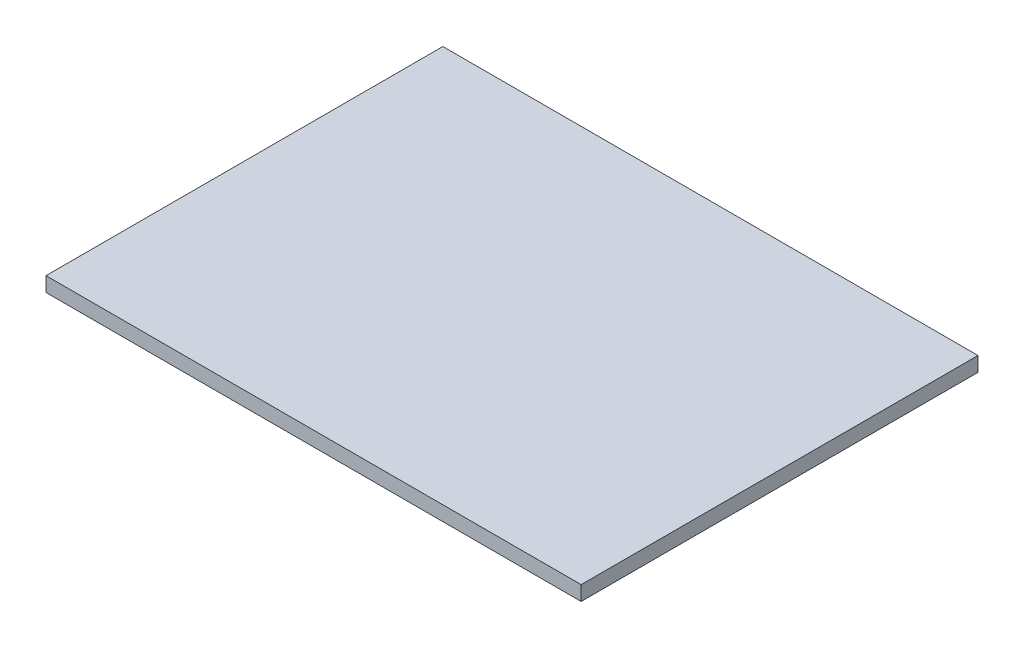
ISO-10303-21;
HEADER;
FILE_DESCRIPTION(('STEP AP214'),'2;1');
FILE_NAME('part.step','',(''),(''),'','','');
FILE_SCHEMA(('AUTOMOTIVE_DESIGN { 1 0 10303 214 1 1 1 1 }'));
ENDSEC;
DATA;
#1=APPLICATION_CONTEXT('core data for automotive mechanical design processes');
#2=APPLICATION_PROTOCOL_DEFINITION('international standard','automotive_design',2000,#1);
#3=PRODUCT_CONTEXT('',#1,'mechanical');
#4=PRODUCT('Part','Part','',(#3));
#5=PRODUCT_RELATED_PRODUCT_CATEGORY('part','',(#4));
#6=PRODUCT_DEFINITION_FORMATION('','',#4);
#7=PRODUCT_DEFINITION_CONTEXT('part definition',#1,'design');
#8=PRODUCT_DEFINITION('design','',#6,#7);
#9=PRODUCT_DEFINITION_SHAPE('','',#8);
#10=(LENGTH_UNIT() NAMED_UNIT(*) SI_UNIT(.MILLI.,.METRE.));
#11=(NAMED_UNIT(*) PLANE_ANGLE_UNIT() SI_UNIT($,.RADIAN.));
#12=(NAMED_UNIT(*) SI_UNIT($,.STERADIAN.) SOLID_ANGLE_UNIT());
#13=UNCERTAINTY_MEASURE_WITH_UNIT(LENGTH_MEASURE(1.E-05),#10,'distance_accuracy_value','');
#14=(GEOMETRIC_REPRESENTATION_CONTEXT(3) GLOBAL_UNCERTAINTY_ASSIGNED_CONTEXT((#13)) GLOBAL_UNIT_ASSIGNED_CONTEXT((#10,
#11,#12)) REPRESENTATION_CONTEXT('',''));
#15=CARTESIAN_POINT('',(0.,0.,0.));
#16=DIRECTION('',(0.,0.,1.));
#17=DIRECTION('',(1.,0.,0.));
#18=AXIS2_PLACEMENT_3D('',#15,#16,#17);
#19=CARTESIAN_POINT('',(476.,-13.,-353.));
#20=DIRECTION('',(-1.,0.,0.));
#21=DIRECTION('',(0.,0.,-1.));
#22=AXIS2_PLACEMENT_3D('',#19,#20,#21);
#23=PLANE('',#22);
#24=DIRECTION('',(0.,1.,0.));
#25=VECTOR('',#24,1.);
#26=CARTESIAN_POINT('',(476.,-13.,353.));
#27=LINE('',#26,#25);
#28=CARTESIAN_POINT('',(476.,-13.,353.));
#29=VERTEX_POINT('',#28);
#30=CARTESIAN_POINT('',(476.,13.,353.));
#31=VERTEX_POINT('',#30);
#32=EDGE_CURVE('E79',#29,#31,#27,.T.);
#33=ORIENTED_EDGE('',*,*,#32,.F.);
#34=DIRECTION('',(0.,0.,1.));
#35=VECTOR('',#34,1.);
#36=CARTESIAN_POINT('',(476.,-13.,-353.));
#37=LINE('',#36,#35);
#38=CARTESIAN_POINT('',(476.,-13.,-353.));
#39=VERTEX_POINT('',#38);
#40=EDGE_CURVE('E78',#39,#29,#37,.T.);
#41=ORIENTED_EDGE('',*,*,#40,.F.);
#42=DIRECTION('',(0.,1.,0.));
#43=VECTOR('',#42,1.);
#44=CARTESIAN_POINT('',(476.,-13.,-353.));
#45=LINE('',#44,#43);
#46=CARTESIAN_POINT('',(476.,13.,-353.));
#47=VERTEX_POINT('',#46);
#48=EDGE_CURVE('E73',#39,#47,#45,.T.);
#49=ORIENTED_EDGE('',*,*,#48,.T.);
#50=DIRECTION('',(0.,0.,1.));
#51=VECTOR('',#50,1.);
#52=CARTESIAN_POINT('',(476.,13.,-353.));
#53=LINE('',#52,#51);
#54=EDGE_CURVE('E11',#47,#31,#53,.T.);
#55=ORIENTED_EDGE('',*,*,#54,.T.);
#56=EDGE_LOOP('',(#33,#41,#49,#55));
#57=FACE_BOUND('',#56,.T.);
#58=ADVANCED_FACE('F16',(#57),#23,.F.);
#59=CARTESIAN_POINT('',(-476.,13.,-353.));
#60=DIRECTION('',(0.,-1.,0.));
#61=DIRECTION('',(0.,0.,1.));
#62=AXIS2_PLACEMENT_3D('',#59,#60,#61);
#63=PLANE('',#62);
#64=DIRECTION('',(-1.,0.,0.));
#65=VECTOR('',#64,1.);
#66=CARTESIAN_POINT('',(-476.,13.,353.));
#67=LINE('',#66,#65);
#68=CARTESIAN_POINT('',(-476.,13.,353.));
#69=VERTEX_POINT('',#68);
#70=EDGE_CURVE('E81',#31,#69,#67,.T.);
#71=ORIENTED_EDGE('',*,*,#70,.F.);
#72=ORIENTED_EDGE('',*,*,#54,.F.);
#73=DIRECTION('',(-1.,0.,0.));
#74=VECTOR('',#73,1.);
#75=CARTESIAN_POINT('',(-476.,13.,-353.));
#76=LINE('',#75,#74);
#77=CARTESIAN_POINT('',(-476.,13.,-353.));
#78=VERTEX_POINT('',#77);
#79=EDGE_CURVE('E57',#47,#78,#76,.T.);
#80=ORIENTED_EDGE('',*,*,#79,.T.);
#81=DIRECTION('',(0.,0.,1.));
#82=VECTOR('',#81,1.);
#83=CARTESIAN_POINT('',(-476.,13.,-353.));
#84=LINE('',#83,#82);
#85=EDGE_CURVE('E24',#78,#69,#84,.T.);
#86=ORIENTED_EDGE('',*,*,#85,.T.);
#87=EDGE_LOOP('',(#71,#72,#80,#86));
#88=FACE_BOUND('',#87,.T.);
#89=ADVANCED_FACE('F71',(#88),#63,.F.);
#90=CARTESIAN_POINT('',(-476.,-13.,-353.));
#91=DIRECTION('',(1.,0.,0.));
#92=DIRECTION('',(0.,0.,1.));
#93=AXIS2_PLACEMENT_3D('',#90,#91,#92);
#94=PLANE('',#93);
#95=DIRECTION('',(0.,-1.,0.));
#96=VECTOR('',#95,1.);
#97=CARTESIAN_POINT('',(-476.,-13.,353.));
#98=LINE('',#97,#96);
#99=CARTESIAN_POINT('',(-476.,-13.,353.));
#100=VERTEX_POINT('',#99);
#101=EDGE_CURVE('E67',#69,#100,#98,.T.);
#102=ORIENTED_EDGE('',*,*,#101,.F.);
#103=ORIENTED_EDGE('',*,*,#85,.F.);
#104=DIRECTION('',(0.,-1.,0.));
#105=VECTOR('',#104,1.);
#106=CARTESIAN_POINT('',(-476.,-13.,-353.));
#107=LINE('',#106,#105);
#108=CARTESIAN_POINT('',(-476.,-13.,-353.));
#109=VERTEX_POINT('',#108);
#110=EDGE_CURVE('E60',#78,#109,#107,.T.);
#111=ORIENTED_EDGE('',*,*,#110,.T.);
#112=DIRECTION('',(0.,0.,1.));
#113=VECTOR('',#112,1.);
#114=CARTESIAN_POINT('',(-476.,-13.,-353.));
#115=LINE('',#114,#113);
#116=EDGE_CURVE('E70',#109,#100,#115,.T.);
#117=ORIENTED_EDGE('',*,*,#116,.T.);
#118=EDGE_LOOP('',(#102,#103,#111,#117));
#119=FACE_BOUND('',#118,.T.);
#120=ADVANCED_FACE('F66',(#119),#94,.F.);
#121=CARTESIAN_POINT('',(-476.,-13.,-353.));
#122=DIRECTION('',(0.,1.,0.));
#123=DIRECTION('',(0.,0.,-1.));
#124=AXIS2_PLACEMENT_3D('',#121,#122,#123);
#125=PLANE('',#124);
#126=DIRECTION('',(1.,0.,0.));
#127=VECTOR('',#126,1.);
#128=CARTESIAN_POINT('',(-476.,-13.,353.));
#129=LINE('',#128,#127);
#130=EDGE_CURVE('E46',#100,#29,#129,.T.);
#131=ORIENTED_EDGE('',*,*,#130,.F.);
#132=ORIENTED_EDGE('',*,*,#116,.F.);
#133=DIRECTION('',(1.,0.,0.));
#134=VECTOR('',#133,1.);
#135=CARTESIAN_POINT('',(-476.,-13.,-353.));
#136=LINE('',#135,#134);
#137=EDGE_CURVE('E32',#109,#39,#136,.T.);
#138=ORIENTED_EDGE('',*,*,#137,.T.);
#139=ORIENTED_EDGE('',*,*,#40,.T.);
#140=EDGE_LOOP('',(#131,#132,#138,#139));
#141=FACE_BOUND('',#140,.T.);
#142=ADVANCED_FACE('F90',(#141),#125,.F.);
#143=CARTESIAN_POINT('',(476.,13.,-353.));
#144=DIRECTION('',(0.,0.,1.));
#145=DIRECTION('',(-1.,0.,0.));
#146=AXIS2_PLACEMENT_3D('',#143,#144,#145);
#147=PLANE('',#146);
#148=ORIENTED_EDGE('',*,*,#48,.F.);
#149=ORIENTED_EDGE('',*,*,#137,.F.);
#150=ORIENTED_EDGE('',*,*,#110,.F.);
#151=ORIENTED_EDGE('',*,*,#79,.F.);
#152=EDGE_LOOP('',(#148,#149,#150,#151));
#153=FACE_BOUND('',#152,.T.);
#154=ADVANCED_FACE('F62',(#153),#147,.F.);
#155=CARTESIAN_POINT('',(476.,13.,353.));
#156=DIRECTION('',(0.,0.,1.));
#157=DIRECTION('',(-1.,0.,0.));
#158=AXIS2_PLACEMENT_3D('',#155,#156,#157);
#159=PLANE('',#158);
#160=ORIENTED_EDGE('',*,*,#32,.T.);
#161=ORIENTED_EDGE('',*,*,#70,.T.);
#162=ORIENTED_EDGE('',*,*,#101,.T.);
#163=ORIENTED_EDGE('',*,*,#130,.T.);
#164=EDGE_LOOP('',(#160,#161,#162,#163));
#165=FACE_BOUND('',#164,.T.);
#166=ADVANCED_FACE('F86',(#165),#159,.T.);
#167=CLOSED_SHELL('',(#58,#89,#120,#142,#154,#166));
#168=MANIFOLD_SOLID_BREP('B1',#167);
#169=ADVANCED_BREP_SHAPE_REPRESENTATION('',(#18,#168),#14);
#170=SHAPE_DEFINITION_REPRESENTATION(#9,#169);
ENDSEC;
END-ISO-10303-21;
